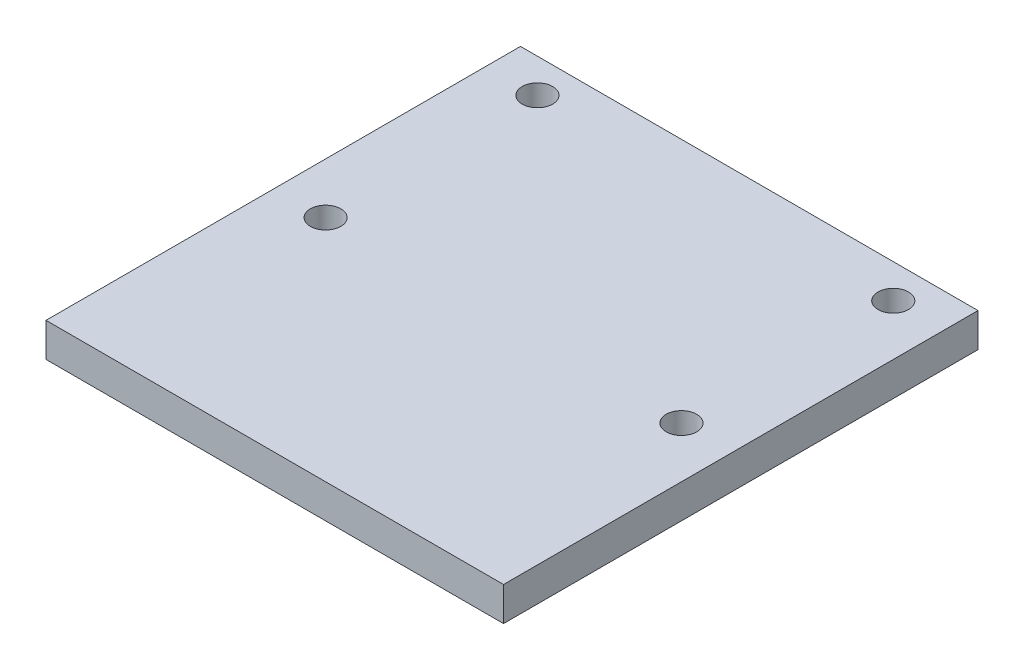
ISO-10303-21;
HEADER;
FILE_DESCRIPTION(('STEP AP214'),'2;1');
FILE_NAME('part.step','',(''),(''),'','','');
FILE_SCHEMA(('AUTOMOTIVE_DESIGN { 1 0 10303 214 1 1 1 1 }'));
ENDSEC;
DATA;
#1=APPLICATION_CONTEXT('core data for automotive mechanical design processes');
#2=APPLICATION_PROTOCOL_DEFINITION('international standard','automotive_design',2000,#1);
#3=PRODUCT_CONTEXT('',#1,'mechanical');
#4=PRODUCT('Part','Part','',(#3));
#5=PRODUCT_RELATED_PRODUCT_CATEGORY('part','',(#4));
#6=PRODUCT_DEFINITION_FORMATION('','',#4);
#7=PRODUCT_DEFINITION_CONTEXT('part definition',#1,'design');
#8=PRODUCT_DEFINITION('design','',#6,#7);
#9=PRODUCT_DEFINITION_SHAPE('','',#8);
#10=(LENGTH_UNIT() NAMED_UNIT(*) SI_UNIT(.MILLI.,.METRE.));
#11=(NAMED_UNIT(*) PLANE_ANGLE_UNIT() SI_UNIT($,.RADIAN.));
#12=(NAMED_UNIT(*) SI_UNIT($,.STERADIAN.) SOLID_ANGLE_UNIT());
#13=UNCERTAINTY_MEASURE_WITH_UNIT(LENGTH_MEASURE(1.E-05),#10,'distance_accuracy_value','');
#14=(GEOMETRIC_REPRESENTATION_CONTEXT(3) GLOBAL_UNCERTAINTY_ASSIGNED_CONTEXT((#13)) GLOBAL_UNIT_ASSIGNED_CONTEXT((#10,
#11,#12)) REPRESENTATION_CONTEXT('',''));
#15=CARTESIAN_POINT('',(0.,0.,0.));
#16=DIRECTION('',(0.,0.,1.));
#17=DIRECTION('',(1.,0.,0.));
#18=AXIS2_PLACEMENT_3D('',#15,#16,#17);
#19=CARTESIAN_POINT('',(-13.5,-2.,0.));
#20=DIRECTION('',(-1.,0.,0.));
#21=DIRECTION('',(0.,0.,1.));
#22=AXIS2_PLACEMENT_3D('',#19,#20,#21);
#23=PLANE('',#22);
#24=DIRECTION('',(0.,0.,1.));
#25=VECTOR('',#24,1.);
#26=CARTESIAN_POINT('',(-13.5,0.,0.));
#27=LINE('',#26,#25);
#28=CARTESIAN_POINT('',(-13.5,0.,0.));
#29=VERTEX_POINT('',#28);
#30=CARTESIAN_POINT('',(-13.5,0.,28.));
#31=VERTEX_POINT('',#30);
#32=EDGE_CURVE('E104',#29,#31,#27,.T.);
#33=ORIENTED_EDGE('',*,*,#32,.F.);
#34=DIRECTION('',(0.,1.,0.));
#35=VECTOR('',#34,1.);
#36=CARTESIAN_POINT('',(-13.5,-2.,0.));
#37=LINE('',#36,#35);
#38=CARTESIAN_POINT('',(-13.5,-2.,0.));
#39=VERTEX_POINT('',#38);
#40=EDGE_CURVE('E11',#39,#29,#37,.T.);
#41=ORIENTED_EDGE('',*,*,#40,.F.);
#42=DIRECTION('',(0.,0.,1.));
#43=VECTOR('',#42,1.);
#44=CARTESIAN_POINT('',(-13.5,-2.,0.));
#45=LINE('',#44,#43);
#46=CARTESIAN_POINT('',(-13.5,-2.,28.));
#47=VERTEX_POINT('',#46);
#48=EDGE_CURVE('E97',#39,#47,#45,.T.);
#49=ORIENTED_EDGE('',*,*,#48,.T.);
#50=DIRECTION('',(0.,1.,0.));
#51=VECTOR('',#50,1.);
#52=CARTESIAN_POINT('',(-13.5,-2.,28.));
#53=LINE('',#52,#51);
#54=EDGE_CURVE('E42',#47,#31,#53,.T.);
#55=ORIENTED_EDGE('',*,*,#54,.T.);
#56=EDGE_LOOP('',(#33,#41,#49,#55));
#57=FACE_BOUND('',#56,.T.);
#58=ADVANCED_FACE('F39',(#57),#23,.T.);
#59=CARTESIAN_POINT('',(-13.5,-2.,0.));
#60=DIRECTION('',(0.,0.,-1.));
#61=DIRECTION('',(-1.,0.,0.));
#62=AXIS2_PLACEMENT_3D('',#59,#60,#61);
#63=PLANE('',#62);
#64=DIRECTION('',(-1.,0.,0.));
#65=VECTOR('',#64,1.);
#66=CARTESIAN_POINT('',(-13.5,0.,0.));
#67=LINE('',#66,#65);
#68=CARTESIAN_POINT('',(13.5,0.,0.));
#69=VERTEX_POINT('',#68);
#70=EDGE_CURVE('E99',#69,#29,#67,.T.);
#71=ORIENTED_EDGE('',*,*,#70,.F.);
#72=DIRECTION('',(0.,1.,0.));
#73=VECTOR('',#72,1.);
#74=CARTESIAN_POINT('',(13.5,-2.,0.));
#75=LINE('',#74,#73);
#76=CARTESIAN_POINT('',(13.5,-2.,0.));
#77=VERTEX_POINT('',#76);
#78=EDGE_CURVE('E48',#77,#69,#75,.T.);
#79=ORIENTED_EDGE('',*,*,#78,.F.);
#80=DIRECTION('',(-1.,0.,0.));
#81=VECTOR('',#80,1.);
#82=CARTESIAN_POINT('',(-13.5,-2.,0.));
#83=LINE('',#82,#81);
#84=EDGE_CURVE('E94',#77,#39,#83,.T.);
#85=ORIENTED_EDGE('',*,*,#84,.T.);
#86=ORIENTED_EDGE('',*,*,#40,.T.);
#87=EDGE_LOOP('',(#71,#79,#85,#86));
#88=FACE_BOUND('',#87,.T.);
#89=ADVANCED_FACE('F115',(#88),#63,.T.);
#90=CARTESIAN_POINT('',(13.5,-2.,0.));
#91=DIRECTION('',(1.,0.,0.));
#92=DIRECTION('',(0.,0.,-1.));
#93=AXIS2_PLACEMENT_3D('',#90,#91,#92);
#94=PLANE('',#93);
#95=DIRECTION('',(0.,0.,-1.));
#96=VECTOR('',#95,1.);
#97=CARTESIAN_POINT('',(13.5,0.,0.));
#98=LINE('',#97,#96);
#99=CARTESIAN_POINT('',(13.5,0.,28.));
#100=VERTEX_POINT('',#99);
#101=EDGE_CURVE('E89',#100,#69,#98,.T.);
#102=ORIENTED_EDGE('',*,*,#101,.F.);
#103=DIRECTION('',(0.,1.,0.));
#104=VECTOR('',#103,1.);
#105=CARTESIAN_POINT('',(13.5,-2.,28.));
#106=LINE('',#105,#104);
#107=CARTESIAN_POINT('',(13.5,-2.,28.));
#108=VERTEX_POINT('',#107);
#109=EDGE_CURVE('E84',#108,#100,#106,.T.);
#110=ORIENTED_EDGE('',*,*,#109,.F.);
#111=DIRECTION('',(0.,0.,-1.));
#112=VECTOR('',#111,1.);
#113=CARTESIAN_POINT('',(13.5,-2.,0.));
#114=LINE('',#113,#112);
#115=EDGE_CURVE('E87',#108,#77,#114,.T.);
#116=ORIENTED_EDGE('',*,*,#115,.T.);
#117=ORIENTED_EDGE('',*,*,#78,.T.);
#118=EDGE_LOOP('',(#102,#110,#116,#117));
#119=FACE_BOUND('',#118,.T.);
#120=ADVANCED_FACE('F86',(#119),#94,.T.);
#121=CARTESIAN_POINT('',(-13.5,-2.,28.));
#122=DIRECTION('',(0.,0.,1.));
#123=DIRECTION('',(1.,0.,0.));
#124=AXIS2_PLACEMENT_3D('',#121,#122,#123);
#125=PLANE('',#124);
#126=DIRECTION('',(1.,0.,0.));
#127=VECTOR('',#126,1.);
#128=CARTESIAN_POINT('',(-13.5,0.,28.));
#129=LINE('',#128,#127);
#130=EDGE_CURVE('E107',#31,#100,#129,.T.);
#131=ORIENTED_EDGE('',*,*,#130,.F.);
#132=ORIENTED_EDGE('',*,*,#54,.F.);
#133=DIRECTION('',(1.,0.,0.));
#134=VECTOR('',#133,1.);
#135=CARTESIAN_POINT('',(-13.5,-2.,28.));
#136=LINE('',#135,#134);
#137=EDGE_CURVE('E93',#47,#108,#136,.T.);
#138=ORIENTED_EDGE('',*,*,#137,.T.);
#139=ORIENTED_EDGE('',*,*,#109,.T.);
#140=EDGE_LOOP('',(#131,#132,#138,#139));
#141=FACE_BOUND('',#140,.T.);
#142=ADVANCED_FACE('F96',(#141),#125,.T.);
#143=CARTESIAN_POINT('',(0.,-2.,0.));
#144=DIRECTION('',(0.,1.,0.));
#145=DIRECTION('',(0.,0.,1.));
#146=AXIS2_PLACEMENT_3D('',#143,#144,#145);
#147=PLANE('',#146);
#148=CARTESIAN_POINT('',(10.5,-2.,2.));
#149=DIRECTION('',(0.,1.,0.));
#150=DIRECTION('',(0.,0.,1.));
#151=AXIS2_PLACEMENT_3D('',#148,#149,#150);
#152=CIRCLE('',#151,0.9);
#153=CARTESIAN_POINT('',(10.5,-2.,2.9));
#154=VERTEX_POINT('',#153);
#155=EDGE_CURVE('E108',#154,#154,#152,.T.);
#156=ORIENTED_EDGE('',*,*,#155,.T.);
#157=EDGE_LOOP('',(#156));
#158=FACE_BOUND('',#157,.T.);
#159=CARTESIAN_POINT('',(10.5,-2.,14.5));
#160=DIRECTION('',(0.,1.,0.));
#161=DIRECTION('',(0.,0.,1.));
#162=AXIS2_PLACEMENT_3D('',#159,#160,#161);
#163=CIRCLE('',#162,0.899999999999999);
#164=CARTESIAN_POINT('',(10.5,-2.,15.4));
#165=VERTEX_POINT('',#164);
#166=EDGE_CURVE('E162',#165,#165,#163,.T.);
#167=ORIENTED_EDGE('',*,*,#166,.T.);
#168=EDGE_LOOP('',(#167));
#169=FACE_BOUND('',#168,.T.);
#170=CARTESIAN_POINT('',(-10.5,-2.,14.5));
#171=DIRECTION('',(0.,1.,0.));
#172=DIRECTION('',(0.,0.,1.));
#173=AXIS2_PLACEMENT_3D('',#170,#171,#172);
#174=CIRCLE('',#173,0.899999999999999);
#175=CARTESIAN_POINT('',(-10.5,-2.,15.4));
#176=VERTEX_POINT('',#175);
#177=EDGE_CURVE('E160',#176,#176,#174,.T.);
#178=ORIENTED_EDGE('',*,*,#177,.T.);
#179=EDGE_LOOP('',(#178));
#180=FACE_BOUND('',#179,.T.);
#181=CARTESIAN_POINT('',(-10.5,-2.,2.));
#182=DIRECTION('',(0.,1.,0.));
#183=DIRECTION('',(0.,0.,1.));
#184=AXIS2_PLACEMENT_3D('',#181,#182,#183);
#185=CIRCLE('',#184,0.9);
#186=CARTESIAN_POINT('',(-10.5,-2.,2.9));
#187=VERTEX_POINT('',#186);
#188=EDGE_CURVE('E163',#187,#187,#185,.T.);
#189=ORIENTED_EDGE('',*,*,#188,.T.);
#190=EDGE_LOOP('',(#189));
#191=FACE_BOUND('',#190,.T.);
#192=ORIENTED_EDGE('',*,*,#48,.F.);
#193=ORIENTED_EDGE('',*,*,#84,.F.);
#194=ORIENTED_EDGE('',*,*,#115,.F.);
#195=ORIENTED_EDGE('',*,*,#137,.F.);
#196=EDGE_LOOP('',(#192,#193,#194,#195));
#197=FACE_BOUND('',#196,.T.);
#198=ADVANCED_FACE('F92',(#158,#169,#180,#191,#197),#147,.F.);
#199=CARTESIAN_POINT('',(0.,0.,0.));
#200=DIRECTION('',(0.,1.,0.));
#201=DIRECTION('',(0.,0.,1.));
#202=AXIS2_PLACEMENT_3D('',#199,#200,#201);
#203=PLANE('',#202);
#204=CARTESIAN_POINT('',(10.5,0.,2.));
#205=DIRECTION('',(0.,1.,0.));
#206=DIRECTION('',(0.,0.,-1.));
#207=AXIS2_PLACEMENT_3D('',#204,#205,#206);
#208=CIRCLE('',#207,0.9);
#209=CARTESIAN_POINT('',(10.5,0.,1.1));
#210=VERTEX_POINT('',#209);
#211=EDGE_CURVE('E175',#210,#210,#208,.T.);
#212=ORIENTED_EDGE('',*,*,#211,.F.);
#213=EDGE_LOOP('',(#212));
#214=FACE_BOUND('',#213,.T.);
#215=CARTESIAN_POINT('',(10.5,0.,14.5));
#216=DIRECTION('',(0.,1.,0.));
#217=DIRECTION('',(0.,0.,-1.));
#218=AXIS2_PLACEMENT_3D('',#215,#216,#217);
#219=CIRCLE('',#218,0.899999999999999);
#220=CARTESIAN_POINT('',(10.5,0.,13.6));
#221=VERTEX_POINT('',#220);
#222=EDGE_CURVE('E178',#221,#221,#219,.T.);
#223=ORIENTED_EDGE('',*,*,#222,.F.);
#224=EDGE_LOOP('',(#223));
#225=FACE_BOUND('',#224,.T.);
#226=CARTESIAN_POINT('',(-10.5,0.,14.5));
#227=DIRECTION('',(0.,1.,0.));
#228=DIRECTION('',(0.,0.,1.));
#229=AXIS2_PLACEMENT_3D('',#226,#227,#228);
#230=CIRCLE('',#229,0.899999999999999);
#231=CARTESIAN_POINT('',(-10.5,0.,15.4));
#232=VERTEX_POINT('',#231);
#233=EDGE_CURVE('E157',#232,#232,#230,.T.);
#234=ORIENTED_EDGE('',*,*,#233,.F.);
#235=EDGE_LOOP('',(#234));
#236=FACE_BOUND('',#235,.T.);
#237=CARTESIAN_POINT('',(-10.5,0.,2.));
#238=DIRECTION('',(0.,1.,0.));
#239=DIRECTION('',(0.,0.,1.));
#240=AXIS2_PLACEMENT_3D('',#237,#238,#239);
#241=CIRCLE('',#240,0.9);
#242=CARTESIAN_POINT('',(-10.5,0.,2.9));
#243=VERTEX_POINT('',#242);
#244=EDGE_CURVE('E168',#243,#243,#241,.T.);
#245=ORIENTED_EDGE('',*,*,#244,.F.);
#246=EDGE_LOOP('',(#245));
#247=FACE_BOUND('',#246,.T.);
#248=ORIENTED_EDGE('',*,*,#32,.T.);
#249=ORIENTED_EDGE('',*,*,#130,.T.);
#250=ORIENTED_EDGE('',*,*,#101,.T.);
#251=ORIENTED_EDGE('',*,*,#70,.T.);
#252=EDGE_LOOP('',(#248,#249,#250,#251));
#253=FACE_BOUND('',#252,.T.);
#254=ADVANCED_FACE('F114',(#214,#225,#236,#247,#253),#203,.T.);
#255=CARTESIAN_POINT('',(-10.5,-10.,2.));
#256=DIRECTION('',(0.,1.,0.));
#257=DIRECTION('',(0.,0.,1.));
#258=AXIS2_PLACEMENT_3D('',#255,#256,#257);
#259=CYLINDRICAL_SURFACE('',#258,0.9);
#260=ORIENTED_EDGE('',*,*,#244,.T.);
#261=EDGE_LOOP('',(#260));
#262=FACE_BOUND('',#261,.T.);
#263=ORIENTED_EDGE('',*,*,#188,.F.);
#264=EDGE_LOOP('',(#263));
#265=FACE_BOUND('',#264,.T.);
#266=ADVANCED_FACE('F133',(#262,#265),#259,.F.);
#267=CARTESIAN_POINT('',(-10.5,-10.,14.5));
#268=DIRECTION('',(0.,1.,0.));
#269=DIRECTION('',(0.,0.,1.));
#270=AXIS2_PLACEMENT_3D('',#267,#268,#269);
#271=CYLINDRICAL_SURFACE('',#270,0.899999999999999);
#272=ORIENTED_EDGE('',*,*,#233,.T.);
#273=EDGE_LOOP('',(#272));
#274=FACE_BOUND('',#273,.T.);
#275=ORIENTED_EDGE('',*,*,#177,.F.);
#276=EDGE_LOOP('',(#275));
#277=FACE_BOUND('',#276,.T.);
#278=ADVANCED_FACE('F140',(#274,#277),#271,.F.);
#279=CARTESIAN_POINT('',(10.5,-10.,14.5));
#280=DIRECTION('',(0.,1.,0.));
#281=DIRECTION('',(0.,0.,1.));
#282=AXIS2_PLACEMENT_3D('',#279,#280,#281);
#283=CYLINDRICAL_SURFACE('',#282,0.899999999999999);
#284=ORIENTED_EDGE('',*,*,#222,.T.);
#285=EDGE_LOOP('',(#284));
#286=FACE_BOUND('',#285,.T.);
#287=ORIENTED_EDGE('',*,*,#166,.F.);
#288=EDGE_LOOP('',(#287));
#289=FACE_BOUND('',#288,.T.);
#290=ADVANCED_FACE('F145',(#286,#289),#283,.F.);
#291=CARTESIAN_POINT('',(10.5,-10.,2.));
#292=DIRECTION('',(0.,1.,0.));
#293=DIRECTION('',(0.,0.,1.));
#294=AXIS2_PLACEMENT_3D('',#291,#292,#293);
#295=CYLINDRICAL_SURFACE('',#294,0.9);
#296=ORIENTED_EDGE('',*,*,#211,.T.);
#297=EDGE_LOOP('',(#296));
#298=FACE_BOUND('',#297,.T.);
#299=ORIENTED_EDGE('',*,*,#155,.F.);
#300=EDGE_LOOP('',(#299));
#301=FACE_BOUND('',#300,.T.);
#302=ADVANCED_FACE('F142',(#298,#301),#295,.F.);
#303=CLOSED_SHELL('',(#58,#89,#120,#142,#198,#254,#266,#278,#290,#302));
#304=MANIFOLD_SOLID_BREP('B2',#303);
#305=ADVANCED_BREP_SHAPE_REPRESENTATION('',(#18,#304),#14);
#306=SHAPE_DEFINITION_REPRESENTATION(#9,#305);
ENDSEC;
END-ISO-10303-21;
